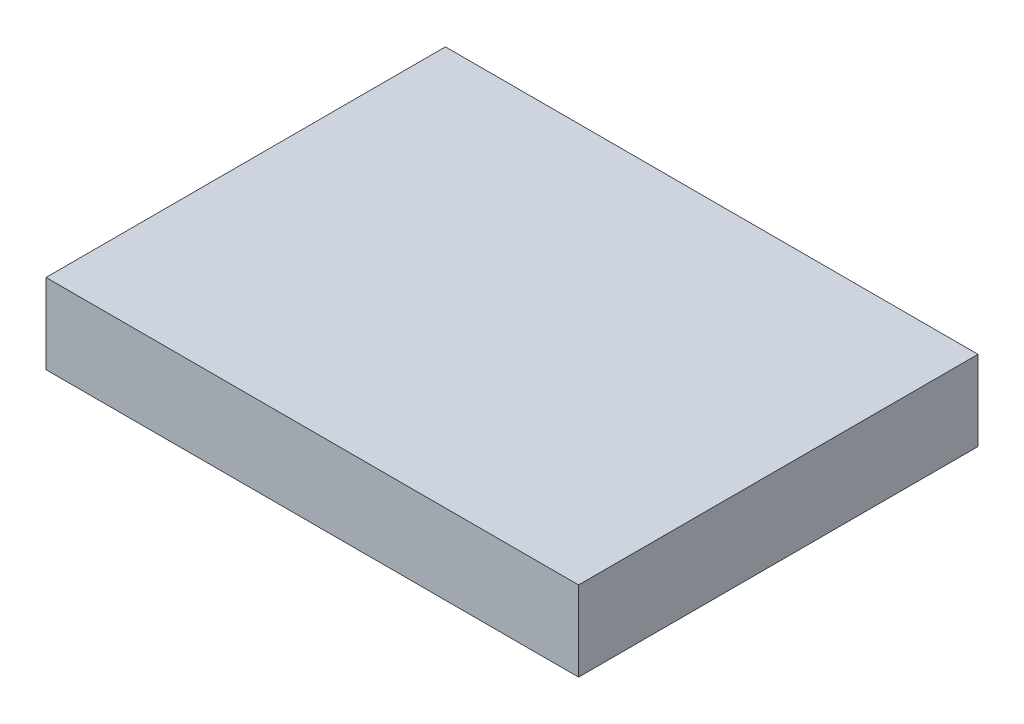
ISO-10303-21;
HEADER;
FILE_DESCRIPTION(('STEP AP214'),'2;1');
FILE_NAME('part.step','',(''),(''),'','','');
FILE_SCHEMA(('AUTOMOTIVE_DESIGN { 1 0 10303 214 1 1 1 1 }'));
ENDSEC;
DATA;
#1=APPLICATION_CONTEXT('core data for automotive mechanical design processes');
#2=APPLICATION_PROTOCOL_DEFINITION('international standard','automotive_design',2000,#1);
#3=PRODUCT_CONTEXT('',#1,'mechanical');
#4=PRODUCT('Part','Part','',(#3));
#5=PRODUCT_RELATED_PRODUCT_CATEGORY('part','',(#4));
#6=PRODUCT_DEFINITION_FORMATION('','',#4);
#7=PRODUCT_DEFINITION_CONTEXT('part definition',#1,'design');
#8=PRODUCT_DEFINITION('design','',#6,#7);
#9=PRODUCT_DEFINITION_SHAPE('','',#8);
#10=(LENGTH_UNIT() NAMED_UNIT(*) SI_UNIT(.MILLI.,.METRE.));
#11=(NAMED_UNIT(*) PLANE_ANGLE_UNIT() SI_UNIT($,.RADIAN.));
#12=(NAMED_UNIT(*) SI_UNIT($,.STERADIAN.) SOLID_ANGLE_UNIT());
#13=UNCERTAINTY_MEASURE_WITH_UNIT(LENGTH_MEASURE(1.E-05),#10,'distance_accuracy_value','');
#14=(GEOMETRIC_REPRESENTATION_CONTEXT(3) GLOBAL_UNCERTAINTY_ASSIGNED_CONTEXT((#13)) GLOBAL_UNIT_ASSIGNED_CONTEXT((#10,
#11,#12)) REPRESENTATION_CONTEXT('',''));
#15=CARTESIAN_POINT('',(0.,0.,0.));
#16=DIRECTION('',(0.,0.,1.));
#17=DIRECTION('',(1.,0.,0.));
#18=AXIS2_PLACEMENT_3D('',#15,#16,#17);
#19=CARTESIAN_POINT('',(-9.99999999999999,3.,7.5));
#20=DIRECTION('',(1.,0.,0.));
#21=DIRECTION('',(0.,0.,-1.));
#22=AXIS2_PLACEMENT_3D('',#19,#20,#21);
#23=PLANE('',#22);
#24=DIRECTION('',(0.,0.,1.));
#25=VECTOR('',#24,1.);
#26=CARTESIAN_POINT('',(-9.99999999999999,0.,7.5));
#27=LINE('',#26,#25);
#28=CARTESIAN_POINT('',(-9.99999999999999,0.,-7.5));
#29=VERTEX_POINT('',#28);
#30=CARTESIAN_POINT('',(-9.99999999999999,0.,7.5));
#31=VERTEX_POINT('',#30);
#32=EDGE_CURVE('E111',#29,#31,#27,.T.);
#33=ORIENTED_EDGE('',*,*,#32,.T.);
#34=DIRECTION('',(0.,-1.,0.));
#35=VECTOR('',#34,1.);
#36=CARTESIAN_POINT('',(-9.99999999999999,3.,7.5));
#37=LINE('',#36,#35);
#38=CARTESIAN_POINT('',(-9.99999999999999,3.,7.5));
#39=VERTEX_POINT('',#38);
#40=EDGE_CURVE('E11',#39,#31,#37,.T.);
#41=ORIENTED_EDGE('',*,*,#40,.F.);
#42=DIRECTION('',(0.,0.,1.));
#43=VECTOR('',#42,1.);
#44=CARTESIAN_POINT('',(-9.99999999999999,3.,7.5));
#45=LINE('',#44,#43);
#46=CARTESIAN_POINT('',(-9.99999999999999,3.,-7.5));
#47=VERTEX_POINT('',#46);
#48=EDGE_CURVE('E95',#47,#39,#45,.T.);
#49=ORIENTED_EDGE('',*,*,#48,.F.);
#50=DIRECTION('',(0.,-1.,0.));
#51=VECTOR('',#50,1.);
#52=CARTESIAN_POINT('',(-9.99999999999999,3.,-7.5));
#53=LINE('',#52,#51);
#54=EDGE_CURVE('E107',#47,#29,#53,.T.);
#55=ORIENTED_EDGE('',*,*,#54,.T.);
#56=EDGE_LOOP('',(#33,#41,#49,#55));
#57=FACE_BOUND('',#56,.T.);
#58=ADVANCED_FACE('F43',(#57),#23,.F.);
#59=CARTESIAN_POINT('',(10.,3.,7.49999999999999));
#60=DIRECTION('',(0.,0.,-1.));
#61=DIRECTION('',(-1.,0.,0.));
#62=AXIS2_PLACEMENT_3D('',#59,#60,#61);
#63=PLANE('',#62);
#64=DIRECTION('',(1.,0.,0.));
#65=VECTOR('',#64,1.);
#66=CARTESIAN_POINT('',(10.,0.,7.49999999999999));
#67=LINE('',#66,#65);
#68=CARTESIAN_POINT('',(10.,0.,7.49999999999999));
#69=VERTEX_POINT('',#68);
#70=EDGE_CURVE('E100',#31,#69,#67,.T.);
#71=ORIENTED_EDGE('',*,*,#70,.T.);
#72=DIRECTION('',(0.,-1.,0.));
#73=VECTOR('',#72,1.);
#74=CARTESIAN_POINT('',(10.,3.,7.49999999999999));
#75=LINE('',#74,#73);
#76=CARTESIAN_POINT('',(10.,3.,7.49999999999999));
#77=VERTEX_POINT('',#76);
#78=EDGE_CURVE('E52',#77,#69,#75,.T.);
#79=ORIENTED_EDGE('',*,*,#78,.F.);
#80=DIRECTION('',(1.,0.,0.));
#81=VECTOR('',#80,1.);
#82=CARTESIAN_POINT('',(10.,3.,7.49999999999999));
#83=LINE('',#82,#81);
#84=EDGE_CURVE('E90',#39,#77,#83,.T.);
#85=ORIENTED_EDGE('',*,*,#84,.F.);
#86=ORIENTED_EDGE('',*,*,#40,.T.);
#87=EDGE_LOOP('',(#71,#79,#85,#86));
#88=FACE_BOUND('',#87,.T.);
#89=ADVANCED_FACE('F99',(#88),#63,.F.);
#90=CARTESIAN_POINT('',(10.,3.,7.49999999999999));
#91=DIRECTION('',(-1.,0.,0.));
#92=DIRECTION('',(0.,0.,1.));
#93=AXIS2_PLACEMENT_3D('',#90,#91,#92);
#94=PLANE('',#93);
#95=DIRECTION('',(0.,0.,-1.));
#96=VECTOR('',#95,1.);
#97=CARTESIAN_POINT('',(10.,0.,7.49999999999999));
#98=LINE('',#97,#96);
#99=CARTESIAN_POINT('',(10.,0.,-7.50000000000001));
#100=VERTEX_POINT('',#99);
#101=EDGE_CURVE('E77',#69,#100,#98,.T.);
#102=ORIENTED_EDGE('',*,*,#101,.T.);
#103=DIRECTION('',(0.,-1.,0.));
#104=VECTOR('',#103,1.);
#105=CARTESIAN_POINT('',(10.,3.,-7.50000000000001));
#106=LINE('',#105,#104);
#107=CARTESIAN_POINT('',(10.,3.,-7.50000000000001));
#108=VERTEX_POINT('',#107);
#109=EDGE_CURVE('E102',#108,#100,#106,.T.);
#110=ORIENTED_EDGE('',*,*,#109,.F.);
#111=DIRECTION('',(0.,0.,-1.));
#112=VECTOR('',#111,1.);
#113=CARTESIAN_POINT('',(10.,3.,7.49999999999999));
#114=LINE('',#113,#112);
#115=EDGE_CURVE('E93',#77,#108,#114,.T.);
#116=ORIENTED_EDGE('',*,*,#115,.F.);
#117=ORIENTED_EDGE('',*,*,#78,.T.);
#118=EDGE_LOOP('',(#102,#110,#116,#117));
#119=FACE_BOUND('',#118,.T.);
#120=ADVANCED_FACE('F103',(#119),#94,.F.);
#121=CARTESIAN_POINT('',(10.,3.,-7.50000000000001));
#122=DIRECTION('',(0.,0.,1.));
#123=DIRECTION('',(1.,0.,0.));
#124=AXIS2_PLACEMENT_3D('',#121,#122,#123);
#125=PLANE('',#124);
#126=DIRECTION('',(-1.,0.,0.));
#127=VECTOR('',#126,1.);
#128=CARTESIAN_POINT('',(10.,0.,-7.50000000000001));
#129=LINE('',#128,#127);
#130=EDGE_CURVE('E83',#100,#29,#129,.T.);
#131=ORIENTED_EDGE('',*,*,#130,.T.);
#132=ORIENTED_EDGE('',*,*,#54,.F.);
#133=DIRECTION('',(-1.,0.,0.));
#134=VECTOR('',#133,1.);
#135=CARTESIAN_POINT('',(10.,3.,-7.50000000000001));
#136=LINE('',#135,#134);
#137=EDGE_CURVE('E60',#108,#47,#136,.T.);
#138=ORIENTED_EDGE('',*,*,#137,.F.);
#139=ORIENTED_EDGE('',*,*,#109,.T.);
#140=EDGE_LOOP('',(#131,#132,#138,#139));
#141=FACE_BOUND('',#140,.T.);
#142=ADVANCED_FACE('F124',(#141),#125,.F.);
#143=CARTESIAN_POINT('',(0.,3.,0.));
#144=DIRECTION('',(0.,1.,0.));
#145=DIRECTION('',(0.,0.,1.));
#146=AXIS2_PLACEMENT_3D('',#143,#144,#145);
#147=PLANE('',#146);
#148=ORIENTED_EDGE('',*,*,#48,.T.);
#149=ORIENTED_EDGE('',*,*,#84,.T.);
#150=ORIENTED_EDGE('',*,*,#115,.T.);
#151=ORIENTED_EDGE('',*,*,#137,.T.);
#152=EDGE_LOOP('',(#148,#149,#150,#151));
#153=FACE_BOUND('',#152,.T.);
#154=ADVANCED_FACE('F91',(#153),#147,.T.);
#155=CARTESIAN_POINT('',(0.,0.,0.));
#156=DIRECTION('',(0.,1.,0.));
#157=DIRECTION('',(0.,0.,1.));
#158=AXIS2_PLACEMENT_3D('',#155,#156,#157);
#159=PLANE('',#158);
#160=ORIENTED_EDGE('',*,*,#32,.F.);
#161=ORIENTED_EDGE('',*,*,#130,.F.);
#162=ORIENTED_EDGE('',*,*,#101,.F.);
#163=ORIENTED_EDGE('',*,*,#70,.F.);
#164=EDGE_LOOP('',(#160,#161,#162,#163));
#165=FACE_BOUND('',#164,.T.);
#166=ADVANCED_FACE('F127',(#165),#159,.F.);
#167=CLOSED_SHELL('',(#58,#89,#120,#142,#154,#166));
#168=MANIFOLD_SOLID_BREP('B2',#167);
#169=ADVANCED_BREP_SHAPE_REPRESENTATION('',(#18,#168),#14);
#170=SHAPE_DEFINITION_REPRESENTATION(#9,#169);
ENDSEC;
END-ISO-10303-21;
